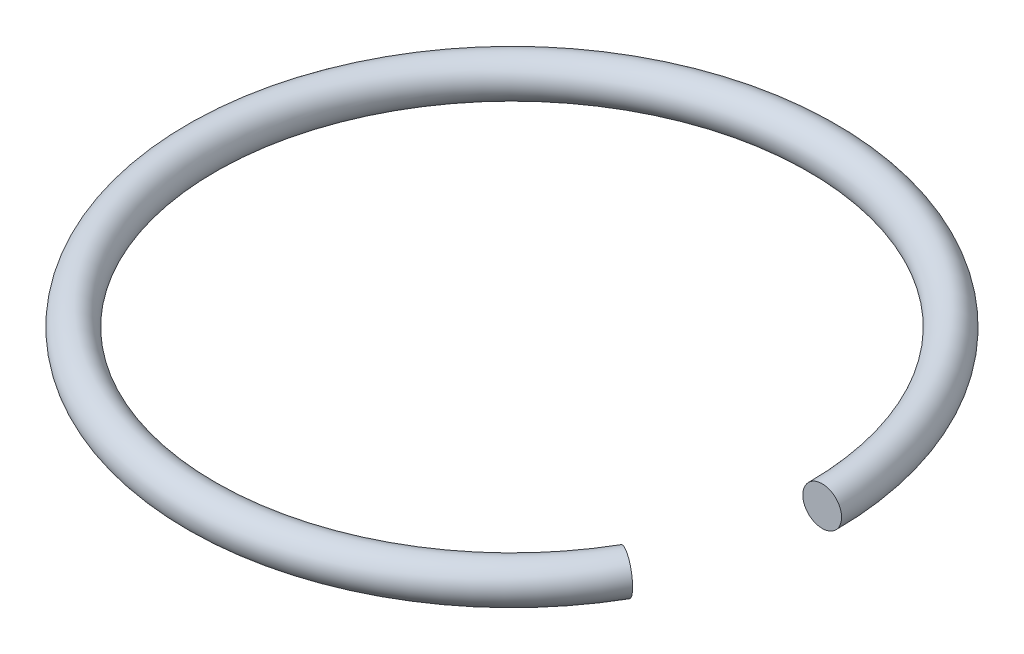
ISO-10303-21;
HEADER;
FILE_DESCRIPTION(('STEP AP214'),'2;1');
FILE_NAME('part.step','',(''),(''),'','','');
FILE_SCHEMA(('AUTOMOTIVE_DESIGN { 1 0 10303 214 1 1 1 1 }'));
ENDSEC;
DATA;
#1=APPLICATION_CONTEXT('core data for automotive mechanical design processes');
#2=APPLICATION_PROTOCOL_DEFINITION('international standard','automotive_design',2000,#1);
#3=PRODUCT_CONTEXT('',#1,'mechanical');
#4=PRODUCT('Part','Part','',(#3));
#5=PRODUCT_RELATED_PRODUCT_CATEGORY('part','',(#4));
#6=PRODUCT_DEFINITION_FORMATION('','',#4);
#7=PRODUCT_DEFINITION_CONTEXT('part definition',#1,'design');
#8=PRODUCT_DEFINITION('design','',#6,#7);
#9=PRODUCT_DEFINITION_SHAPE('','',#8);
#10=(LENGTH_UNIT() NAMED_UNIT(*) SI_UNIT(.MILLI.,.METRE.));
#11=(NAMED_UNIT(*) PLANE_ANGLE_UNIT() SI_UNIT($,.RADIAN.));
#12=(NAMED_UNIT(*) SI_UNIT($,.STERADIAN.) SOLID_ANGLE_UNIT());
#13=UNCERTAINTY_MEASURE_WITH_UNIT(LENGTH_MEASURE(1.E-05),#10,'distance_accuracy_value','');
#14=(GEOMETRIC_REPRESENTATION_CONTEXT(3) GLOBAL_UNCERTAINTY_ASSIGNED_CONTEXT((#13)) GLOBAL_UNIT_ASSIGNED_CONTEXT((#10,
#11,#12)) REPRESENTATION_CONTEXT('',''));
#15=CARTESIAN_POINT('',(0.,0.,0.));
#16=DIRECTION('',(0.,0.,1.));
#17=DIRECTION('',(1.,0.,0.));
#18=AXIS2_PLACEMENT_3D('',#15,#16,#17);
#19=CARTESIAN_POINT('',(0.,0.,0.));
#20=DIRECTION('',(0.,-1.,0.));
#21=DIRECTION('',(0.,0.,-1.));
#22=AXIS2_PLACEMENT_3D('',#19,#20,#21);
#23=TOROIDAL_SURFACE('',#22,8.,0.500000000000001);
#24=CARTESIAN_POINT('',(6.92820323027556,0.,3.99999999999991));
#25=DIRECTION('',(-0.499999999999989,0.,0.866025403784445));
#26=DIRECTION('',(0.866025403784445,0.,0.499999999999989));
#27=AXIS2_PLACEMENT_3D('',#24,#25,#26);
#28=CIRCLE('',#27,0.500000000000001);
#29=CARTESIAN_POINT('',(7.36121593216778,0.,4.24999999999991));
#30=VERTEX_POINT('',#29);
#31=EDGE_CURVE('E10',#30,#30,#28,.T.);
#32=CARTESIAN_POINT('',(8.,0.,0.));
#33=DIRECTION('',(0.,0.,1.));
#34=DIRECTION('',(1.,0.,0.));
#35=AXIS2_PLACEMENT_3D('',#32,#33,#34);
#36=CIRCLE('',#35,0.500000000000001);
#37=CARTESIAN_POINT('',(8.5,0.,0.));
#38=VERTEX_POINT('',#37);
#39=EDGE_CURVE('E44',#38,#38,#36,.T.);
#40=CARTESIAN_POINT('',(0.,0.,0.));
#41=DIRECTION('',(0.,-1.,0.));
#42=DIRECTION('',(0.,0.,-1.));
#43=AXIS2_PLACEMENT_3D('',#40,#41,#42);
#44=CIRCLE('',#43,8.5);
#45=EDGE_CURVE('',#30,#38,#44,.T.);
#46=ORIENTED_EDGE('',*,*,#31,.T.);
#47=ORIENTED_EDGE('',*,*,#39,.F.);
#48=ORIENTED_EDGE('',*,*,#45,.T.);
#49=ORIENTED_EDGE('',*,*,#45,.F.);
#50=EDGE_LOOP('',(#46,#48,#47,#49));
#51=FACE_BOUND('',#50,.T.);
#52=ADVANCED_FACE('F39',(#51),#23,.T.);
#53=CARTESIAN_POINT('',(6.92820323027556,0.,3.99999999999991));
#54=DIRECTION('',(-0.499999999999989,0.,0.866025403784445));
#55=DIRECTION('',(0.866025403784445,0.,0.499999999999989));
#56=AXIS2_PLACEMENT_3D('',#53,#54,#55);
#57=PLANE('',#56);
#58=ORIENTED_EDGE('',*,*,#31,.F.);
#59=EDGE_LOOP('',(#58));
#60=FACE_BOUND('',#59,.T.);
#61=ADVANCED_FACE('F53',(#60),#57,.F.);
#62=CARTESIAN_POINT('',(8.,0.,0.));
#63=DIRECTION('',(0.,0.,1.));
#64=DIRECTION('',(1.,0.,0.));
#65=AXIS2_PLACEMENT_3D('',#62,#63,#64);
#66=PLANE('',#65);
#67=ORIENTED_EDGE('',*,*,#39,.T.);
#68=EDGE_LOOP('',(#67));
#69=FACE_BOUND('',#68,.T.);
#70=ADVANCED_FACE('F51',(#69),#66,.T.);
#71=CLOSED_SHELL('',(#52,#61,#70));
#72=MANIFOLD_SOLID_BREP('B2',#71);
#73=ADVANCED_BREP_SHAPE_REPRESENTATION('',(#18,#72),#14);
#74=SHAPE_DEFINITION_REPRESENTATION(#9,#73);
ENDSEC;
END-ISO-10303-21;
